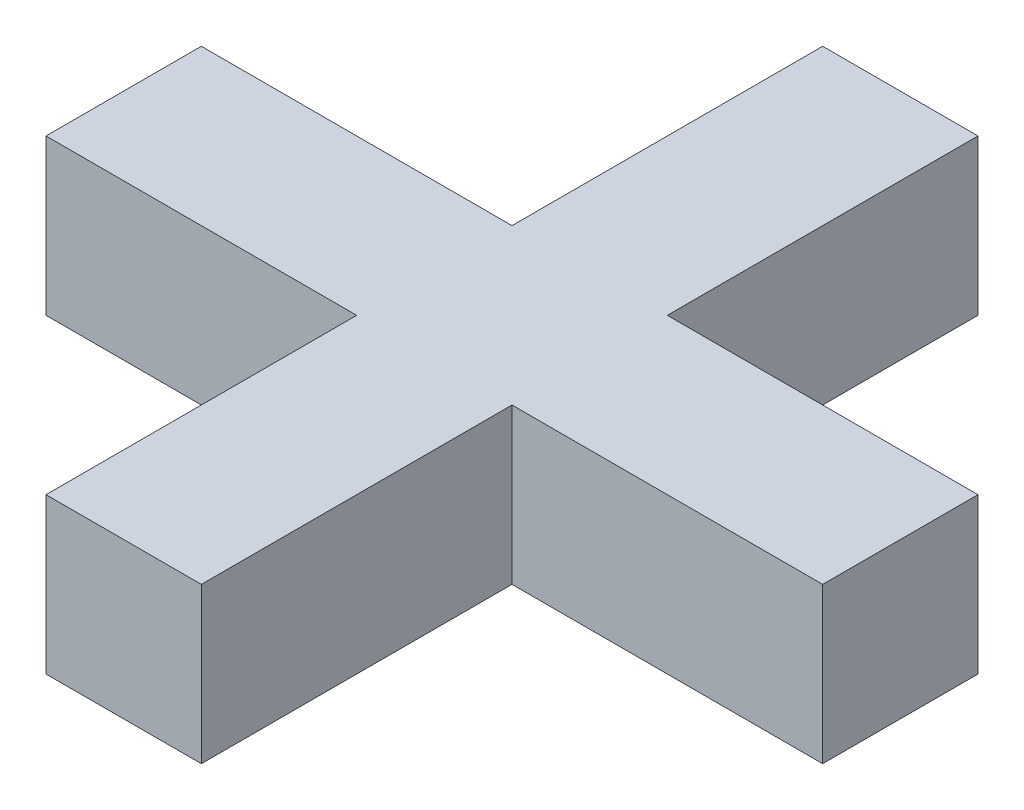
ISO-10303-21;
HEADER;
FILE_DESCRIPTION(('STEP AP214'),'2;1');
FILE_NAME('part.step','',(''),(''),'','','');
FILE_SCHEMA(('AUTOMOTIVE_DESIGN { 1 0 10303 214 1 1 1 1 }'));
ENDSEC;
DATA;
#1=APPLICATION_CONTEXT('core data for automotive mechanical design processes');
#2=APPLICATION_PROTOCOL_DEFINITION('international standard','automotive_design',2000,#1);
#3=PRODUCT_CONTEXT('',#1,'mechanical');
#4=PRODUCT('Part','Part','',(#3));
#5=PRODUCT_RELATED_PRODUCT_CATEGORY('part','',(#4));
#6=PRODUCT_DEFINITION_FORMATION('','',#4);
#7=PRODUCT_DEFINITION_CONTEXT('part definition',#1,'design');
#8=PRODUCT_DEFINITION('design','',#6,#7);
#9=PRODUCT_DEFINITION_SHAPE('','',#8);
#10=(LENGTH_UNIT() NAMED_UNIT(*) SI_UNIT(.MILLI.,.METRE.));
#11=(NAMED_UNIT(*) PLANE_ANGLE_UNIT() SI_UNIT($,.RADIAN.));
#12=(NAMED_UNIT(*) SI_UNIT($,.STERADIAN.) SOLID_ANGLE_UNIT());
#13=UNCERTAINTY_MEASURE_WITH_UNIT(LENGTH_MEASURE(1.E-05),#10,'distance_accuracy_value','');
#14=(GEOMETRIC_REPRESENTATION_CONTEXT(3) GLOBAL_UNCERTAINTY_ASSIGNED_CONTEXT((#13)) GLOBAL_UNIT_ASSIGNED_CONTEXT((#10,
#11,#12)) REPRESENTATION_CONTEXT('',''));
#15=CARTESIAN_POINT('',(0.,0.,0.));
#16=DIRECTION('',(0.,0.,1.));
#17=DIRECTION('',(1.,0.,0.));
#18=AXIS2_PLACEMENT_3D('',#15,#16,#17);
#19=CARTESIAN_POINT('',(-500.,200.,0.));
#20=DIRECTION('',(1.,0.,0.));
#21=DIRECTION('',(0.,0.,-1.));
#22=AXIS2_PLACEMENT_3D('',#19,#20,#21);
#23=PLANE('',#22);
#24=DIRECTION('',(0.,0.,1.));
#25=VECTOR('',#24,1.);
#26=CARTESIAN_POINT('',(-500.,0.,0.));
#27=LINE('',#26,#25);
#28=CARTESIAN_POINT('',(-500.,0.,-100.));
#29=VERTEX_POINT('',#28);
#30=CARTESIAN_POINT('',(-500.,0.,100.));
#31=VERTEX_POINT('',#30);
#32=EDGE_CURVE('E156',#29,#31,#27,.T.);
#33=ORIENTED_EDGE('',*,*,#32,.T.);
#34=DIRECTION('',(0.,-1.,0.));
#35=VECTOR('',#34,1.);
#36=CARTESIAN_POINT('',(-500.,200.,100.));
#37=LINE('',#36,#35);
#38=CARTESIAN_POINT('',(-500.,200.,100.));
#39=VERTEX_POINT('',#38);
#40=EDGE_CURVE('E11',#39,#31,#37,.T.);
#41=ORIENTED_EDGE('',*,*,#40,.F.);
#42=DIRECTION('',(0.,0.,1.));
#43=VECTOR('',#42,1.);
#44=CARTESIAN_POINT('',(-500.,200.,0.));
#45=LINE('',#44,#43);
#46=CARTESIAN_POINT('',(-500.,200.,-100.));
#47=VERTEX_POINT('',#46);
#48=EDGE_CURVE('E186',#47,#39,#45,.T.);
#49=ORIENTED_EDGE('',*,*,#48,.F.);
#50=DIRECTION('',(0.,-1.,0.));
#51=VECTOR('',#50,1.);
#52=CARTESIAN_POINT('',(-500.,200.,-100.));
#53=LINE('',#52,#51);
#54=EDGE_CURVE('E51',#47,#29,#53,.T.);
#55=ORIENTED_EDGE('',*,*,#54,.T.);
#56=EDGE_LOOP('',(#33,#41,#49,#55));
#57=FACE_BOUND('',#56,.T.);
#58=ADVANCED_FACE('F35',(#57),#23,.F.);
#59=CARTESIAN_POINT('',(0.,200.,100.));
#60=DIRECTION('',(0.,0.,-1.));
#61=DIRECTION('',(-1.,0.,0.));
#62=AXIS2_PLACEMENT_3D('',#59,#60,#61);
#63=PLANE('',#62);
#64=DIRECTION('',(1.,0.,0.));
#65=VECTOR('',#64,1.);
#66=CARTESIAN_POINT('',(0.,0.,100.));
#67=LINE('',#66,#65);
#68=CARTESIAN_POINT('',(-100.,0.,100.));
#69=VERTEX_POINT('',#68);
#70=EDGE_CURVE('E158',#31,#69,#67,.T.);
#71=ORIENTED_EDGE('',*,*,#70,.T.);
#72=DIRECTION('',(0.,-1.,0.));
#73=VECTOR('',#72,1.);
#74=CARTESIAN_POINT('',(-100.,200.,100.));
#75=LINE('',#74,#73);
#76=CARTESIAN_POINT('',(-100.,200.,100.));
#77=VERTEX_POINT('',#76);
#78=EDGE_CURVE('E43',#77,#69,#75,.T.);
#79=ORIENTED_EDGE('',*,*,#78,.F.);
#80=DIRECTION('',(1.,0.,0.));
#81=VECTOR('',#80,1.);
#82=CARTESIAN_POINT('',(0.,200.,100.));
#83=LINE('',#82,#81);
#84=EDGE_CURVE('E101',#39,#77,#83,.T.);
#85=ORIENTED_EDGE('',*,*,#84,.F.);
#86=ORIENTED_EDGE('',*,*,#40,.T.);
#87=EDGE_LOOP('',(#71,#79,#85,#86));
#88=FACE_BOUND('',#87,.T.);
#89=ADVANCED_FACE('F209',(#88),#63,.F.);
#90=CARTESIAN_POINT('',(-100.,200.,0.));
#91=DIRECTION('',(-1.,0.,0.));
#92=DIRECTION('',(0.,0.,1.));
#93=AXIS2_PLACEMENT_3D('',#90,#91,#92);
#94=PLANE('',#93);
#95=DIRECTION('',(0.,0.,-1.));
#96=VECTOR('',#95,1.);
#97=CARTESIAN_POINT('',(-100.,0.,0.));
#98=LINE('',#97,#96);
#99=CARTESIAN_POINT('',(-100.,0.,500.));
#100=VERTEX_POINT('',#99);
#101=EDGE_CURVE('E161',#100,#69,#98,.T.);
#102=ORIENTED_EDGE('',*,*,#101,.F.);
#103=DIRECTION('',(0.,-1.,0.));
#104=VECTOR('',#103,1.);
#105=CARTESIAN_POINT('',(-100.,200.,500.));
#106=LINE('',#105,#104);
#107=CARTESIAN_POINT('',(-100.,200.,500.));
#108=VERTEX_POINT('',#107);
#109=EDGE_CURVE('E202',#108,#100,#106,.T.);
#110=ORIENTED_EDGE('',*,*,#109,.F.);
#111=DIRECTION('',(0.,0.,-1.));
#112=VECTOR('',#111,1.);
#113=CARTESIAN_POINT('',(-100.,200.,0.));
#114=LINE('',#113,#112);
#115=EDGE_CURVE('E208',#108,#77,#114,.T.);
#116=ORIENTED_EDGE('',*,*,#115,.T.);
#117=ORIENTED_EDGE('',*,*,#78,.T.);
#118=EDGE_LOOP('',(#102,#110,#116,#117));
#119=FACE_BOUND('',#118,.T.);
#120=ADVANCED_FACE('F206',(#119),#94,.T.);
#121=CARTESIAN_POINT('',(0.,200.,500.));
#122=DIRECTION('',(0.,0.,-1.));
#123=DIRECTION('',(-1.,0.,0.));
#124=AXIS2_PLACEMENT_3D('',#121,#122,#123);
#125=PLANE('',#124);
#126=DIRECTION('',(1.,0.,0.));
#127=VECTOR('',#126,1.);
#128=CARTESIAN_POINT('',(0.,0.,500.));
#129=LINE('',#128,#127);
#130=CARTESIAN_POINT('',(100.,0.,500.));
#131=VERTEX_POINT('',#130);
#132=EDGE_CURVE('E164',#100,#131,#129,.T.);
#133=ORIENTED_EDGE('',*,*,#132,.T.);
#134=DIRECTION('',(0.,-1.,0.));
#135=VECTOR('',#134,1.);
#136=CARTESIAN_POINT('',(100.,200.,500.));
#137=LINE('',#136,#135);
#138=CARTESIAN_POINT('',(100.,200.,500.));
#139=VERTEX_POINT('',#138);
#140=EDGE_CURVE('E199',#139,#131,#137,.T.);
#141=ORIENTED_EDGE('',*,*,#140,.F.);
#142=DIRECTION('',(1.,0.,0.));
#143=VECTOR('',#142,1.);
#144=CARTESIAN_POINT('',(0.,200.,500.));
#145=LINE('',#144,#143);
#146=EDGE_CURVE('E227',#108,#139,#145,.T.);
#147=ORIENTED_EDGE('',*,*,#146,.F.);
#148=ORIENTED_EDGE('',*,*,#109,.T.);
#149=EDGE_LOOP('',(#133,#141,#147,#148));
#150=FACE_BOUND('',#149,.T.);
#151=ADVANCED_FACE('F218',(#150),#125,.F.);
#152=CARTESIAN_POINT('',(100.,200.,0.));
#153=DIRECTION('',(-1.,0.,0.));
#154=DIRECTION('',(0.,0.,1.));
#155=AXIS2_PLACEMENT_3D('',#152,#153,#154);
#156=PLANE('',#155);
#157=DIRECTION('',(0.,0.,-1.));
#158=VECTOR('',#157,1.);
#159=CARTESIAN_POINT('',(100.,0.,0.));
#160=LINE('',#159,#158);
#161=CARTESIAN_POINT('',(100.,0.,100.));
#162=VERTEX_POINT('',#161);
#163=EDGE_CURVE('E166',#131,#162,#160,.T.);
#164=ORIENTED_EDGE('',*,*,#163,.T.);
#165=DIRECTION('',(0.,-1.,0.));
#166=VECTOR('',#165,1.);
#167=CARTESIAN_POINT('',(100.,200.,100.));
#168=LINE('',#167,#166);
#169=CARTESIAN_POINT('',(100.,200.,100.));
#170=VERTEX_POINT('',#169);
#171=EDGE_CURVE('E196',#170,#162,#168,.T.);
#172=ORIENTED_EDGE('',*,*,#171,.F.);
#173=DIRECTION('',(0.,0.,-1.));
#174=VECTOR('',#173,1.);
#175=CARTESIAN_POINT('',(100.,200.,0.));
#176=LINE('',#175,#174);
#177=EDGE_CURVE('E224',#139,#170,#176,.T.);
#178=ORIENTED_EDGE('',*,*,#177,.F.);
#179=ORIENTED_EDGE('',*,*,#140,.T.);
#180=EDGE_LOOP('',(#164,#172,#178,#179));
#181=FACE_BOUND('',#180,.T.);
#182=ADVANCED_FACE('F222',(#181),#156,.F.);
#183=CARTESIAN_POINT('',(0.,200.,100.));
#184=DIRECTION('',(0.,0.,-1.));
#185=DIRECTION('',(-1.,0.,0.));
#186=AXIS2_PLACEMENT_3D('',#183,#184,#185);
#187=PLANE('',#186);
#188=DIRECTION('',(1.,0.,0.));
#189=VECTOR('',#188,1.);
#190=CARTESIAN_POINT('',(0.,0.,100.));
#191=LINE('',#190,#189);
#192=CARTESIAN_POINT('',(500.,0.,100.));
#193=VERTEX_POINT('',#192);
#194=EDGE_CURVE('E168',#162,#193,#191,.T.);
#195=ORIENTED_EDGE('',*,*,#194,.T.);
#196=DIRECTION('',(0.,-1.,0.));
#197=VECTOR('',#196,1.);
#198=CARTESIAN_POINT('',(500.,200.,100.));
#199=LINE('',#198,#197);
#200=CARTESIAN_POINT('',(500.,200.,100.));
#201=VERTEX_POINT('',#200);
#202=EDGE_CURVE('E194',#201,#193,#199,.T.);
#203=ORIENTED_EDGE('',*,*,#202,.F.);
#204=DIRECTION('',(1.,0.,0.));
#205=VECTOR('',#204,1.);
#206=CARTESIAN_POINT('',(0.,200.,100.));
#207=LINE('',#206,#205);
#208=EDGE_CURVE('E226',#170,#201,#207,.T.);
#209=ORIENTED_EDGE('',*,*,#208,.F.);
#210=ORIENTED_EDGE('',*,*,#171,.T.);
#211=EDGE_LOOP('',(#195,#203,#209,#210));
#212=FACE_BOUND('',#211,.T.);
#213=ADVANCED_FACE('F316',(#212),#187,.F.);
#214=CARTESIAN_POINT('',(500.,200.,0.));
#215=DIRECTION('',(1.,0.,0.));
#216=DIRECTION('',(0.,0.,-1.));
#217=AXIS2_PLACEMENT_3D('',#214,#215,#216);
#218=PLANE('',#217);
#219=DIRECTION('',(0.,0.,1.));
#220=VECTOR('',#219,1.);
#221=CARTESIAN_POINT('',(500.,0.,0.));
#222=LINE('',#221,#220);
#223=CARTESIAN_POINT('',(500.,0.,-100.));
#224=VERTEX_POINT('',#223);
#225=EDGE_CURVE('E171',#224,#193,#222,.T.);
#226=ORIENTED_EDGE('',*,*,#225,.F.);
#227=DIRECTION('',(0.,-1.,0.));
#228=VECTOR('',#227,1.);
#229=CARTESIAN_POINT('',(500.,200.,-100.));
#230=LINE('',#229,#228);
#231=CARTESIAN_POINT('',(500.,200.,-100.));
#232=VERTEX_POINT('',#231);
#233=EDGE_CURVE('E192',#232,#224,#230,.T.);
#234=ORIENTED_EDGE('',*,*,#233,.F.);
#235=DIRECTION('',(0.,0.,1.));
#236=VECTOR('',#235,1.);
#237=CARTESIAN_POINT('',(500.,200.,0.));
#238=LINE('',#237,#236);
#239=EDGE_CURVE('E229',#232,#201,#238,.T.);
#240=ORIENTED_EDGE('',*,*,#239,.T.);
#241=ORIENTED_EDGE('',*,*,#202,.T.);
#242=EDGE_LOOP('',(#226,#234,#240,#241));
#243=FACE_BOUND('',#242,.T.);
#244=ADVANCED_FACE('F245',(#243),#218,.T.);
#245=CARTESIAN_POINT('',(0.,200.,-100.));
#246=DIRECTION('',(0.,0.,-1.));
#247=DIRECTION('',(-1.,0.,0.));
#248=AXIS2_PLACEMENT_3D('',#245,#246,#247);
#249=PLANE('',#248);
#250=DIRECTION('',(1.,0.,0.));
#251=VECTOR('',#250,1.);
#252=CARTESIAN_POINT('',(0.,0.,-100.));
#253=LINE('',#252,#251);
#254=CARTESIAN_POINT('',(100.,0.,-100.));
#255=VERTEX_POINT('',#254);
#256=EDGE_CURVE('E174',#255,#224,#253,.T.);
#257=ORIENTED_EDGE('',*,*,#256,.F.);
#258=DIRECTION('',(0.,-1.,0.));
#259=VECTOR('',#258,1.);
#260=CARTESIAN_POINT('',(100.,200.,-100.));
#261=LINE('',#260,#259);
#262=CARTESIAN_POINT('',(100.,200.,-100.));
#263=VERTEX_POINT('',#262);
#264=EDGE_CURVE('E190',#263,#255,#261,.T.);
#265=ORIENTED_EDGE('',*,*,#264,.F.);
#266=DIRECTION('',(1.,0.,0.));
#267=VECTOR('',#266,1.);
#268=CARTESIAN_POINT('',(0.,200.,-100.));
#269=LINE('',#268,#267);
#270=EDGE_CURVE('E236',#263,#232,#269,.T.);
#271=ORIENTED_EDGE('',*,*,#270,.T.);
#272=ORIENTED_EDGE('',*,*,#233,.T.);
#273=EDGE_LOOP('',(#257,#265,#271,#272));
#274=FACE_BOUND('',#273,.T.);
#275=ADVANCED_FACE('F240',(#274),#249,.T.);
#276=CARTESIAN_POINT('',(100.,200.,0.));
#277=DIRECTION('',(-1.,0.,0.));
#278=DIRECTION('',(0.,0.,1.));
#279=AXIS2_PLACEMENT_3D('',#276,#277,#278);
#280=PLANE('',#279);
#281=DIRECTION('',(0.,0.,-1.));
#282=VECTOR('',#281,1.);
#283=CARTESIAN_POINT('',(100.,0.,0.));
#284=LINE('',#283,#282);
#285=CARTESIAN_POINT('',(100.,0.,-500.));
#286=VERTEX_POINT('',#285);
#287=EDGE_CURVE('E177',#255,#286,#284,.T.);
#288=ORIENTED_EDGE('',*,*,#287,.T.);
#289=DIRECTION('',(0.,-1.,0.));
#290=VECTOR('',#289,1.);
#291=CARTESIAN_POINT('',(100.,200.,-500.));
#292=LINE('',#291,#290);
#293=CARTESIAN_POINT('',(100.,200.,-500.));
#294=VERTEX_POINT('',#293);
#295=EDGE_CURVE('E138',#294,#286,#292,.T.);
#296=ORIENTED_EDGE('',*,*,#295,.F.);
#297=DIRECTION('',(0.,0.,-1.));
#298=VECTOR('',#297,1.);
#299=CARTESIAN_POINT('',(100.,200.,0.));
#300=LINE('',#299,#298);
#301=EDGE_CURVE('E147',#263,#294,#300,.T.);
#302=ORIENTED_EDGE('',*,*,#301,.F.);
#303=ORIENTED_EDGE('',*,*,#264,.T.);
#304=EDGE_LOOP('',(#288,#296,#302,#303));
#305=FACE_BOUND('',#304,.T.);
#306=ADVANCED_FACE('F248',(#305),#280,.F.);
#307=CARTESIAN_POINT('',(0.,200.,-500.));
#308=DIRECTION('',(0.,0.,-1.));
#309=DIRECTION('',(-1.,0.,0.));
#310=AXIS2_PLACEMENT_3D('',#307,#308,#309);
#311=PLANE('',#310);
#312=DIRECTION('',(1.,0.,0.));
#313=VECTOR('',#312,1.);
#314=CARTESIAN_POINT('',(0.,0.,-500.));
#315=LINE('',#314,#313);
#316=CARTESIAN_POINT('',(-100.,0.,-500.));
#317=VERTEX_POINT('',#316);
#318=EDGE_CURVE('E134',#317,#286,#315,.T.);
#319=ORIENTED_EDGE('',*,*,#318,.F.);
#320=DIRECTION('',(0.,-1.,0.));
#321=VECTOR('',#320,1.);
#322=CARTESIAN_POINT('',(-100.,200.,-500.));
#323=LINE('',#322,#321);
#324=CARTESIAN_POINT('',(-100.,200.,-500.));
#325=VERTEX_POINT('',#324);
#326=EDGE_CURVE('E129',#325,#317,#323,.T.);
#327=ORIENTED_EDGE('',*,*,#326,.F.);
#328=DIRECTION('',(1.,0.,0.));
#329=VECTOR('',#328,1.);
#330=CARTESIAN_POINT('',(0.,200.,-500.));
#331=LINE('',#330,#329);
#332=EDGE_CURVE('E132',#325,#294,#331,.T.);
#333=ORIENTED_EDGE('',*,*,#332,.T.);
#334=ORIENTED_EDGE('',*,*,#295,.T.);
#335=EDGE_LOOP('',(#319,#327,#333,#334));
#336=FACE_BOUND('',#335,.T.);
#337=ADVANCED_FACE('F131',(#336),#311,.T.);
#338=CARTESIAN_POINT('',(-100.,200.,0.));
#339=DIRECTION('',(-1.,0.,0.));
#340=DIRECTION('',(0.,0.,1.));
#341=AXIS2_PLACEMENT_3D('',#338,#339,#340);
#342=PLANE('',#341);
#343=DIRECTION('',(0.,0.,-1.));
#344=VECTOR('',#343,1.);
#345=CARTESIAN_POINT('',(-100.,0.,0.));
#346=LINE('',#345,#344);
#347=CARTESIAN_POINT('',(-100.,0.,-100.));
#348=VERTEX_POINT('',#347);
#349=EDGE_CURVE('E181',#348,#317,#346,.T.);
#350=ORIENTED_EDGE('',*,*,#349,.F.);
#351=DIRECTION('',(0.,-1.,0.));
#352=VECTOR('',#351,1.);
#353=CARTESIAN_POINT('',(-100.,200.,-100.));
#354=LINE('',#353,#352);
#355=CARTESIAN_POINT('',(-100.,200.,-100.));
#356=VERTEX_POINT('',#355);
#357=EDGE_CURVE('E89',#356,#348,#354,.T.);
#358=ORIENTED_EDGE('',*,*,#357,.F.);
#359=DIRECTION('',(0.,0.,-1.));
#360=VECTOR('',#359,1.);
#361=CARTESIAN_POINT('',(-100.,200.,0.));
#362=LINE('',#361,#360);
#363=EDGE_CURVE('E144',#356,#325,#362,.T.);
#364=ORIENTED_EDGE('',*,*,#363,.T.);
#365=ORIENTED_EDGE('',*,*,#326,.T.);
#366=EDGE_LOOP('',(#350,#358,#364,#365));
#367=FACE_BOUND('',#366,.T.);
#368=ADVANCED_FACE('F150',(#367),#342,.T.);
#369=CARTESIAN_POINT('',(0.,200.,-100.));
#370=DIRECTION('',(0.,0.,-1.));
#371=DIRECTION('',(-1.,0.,0.));
#372=AXIS2_PLACEMENT_3D('',#369,#370,#371);
#373=PLANE('',#372);
#374=DIRECTION('',(1.,0.,0.));
#375=VECTOR('',#374,1.);
#376=CARTESIAN_POINT('',(0.,0.,-100.));
#377=LINE('',#376,#375);
#378=EDGE_CURVE('E183',#29,#348,#377,.T.);
#379=ORIENTED_EDGE('',*,*,#378,.F.);
#380=ORIENTED_EDGE('',*,*,#54,.F.);
#381=DIRECTION('',(1.,0.,0.));
#382=VECTOR('',#381,1.);
#383=CARTESIAN_POINT('',(0.,200.,-100.));
#384=LINE('',#383,#382);
#385=EDGE_CURVE('E151',#47,#356,#384,.T.);
#386=ORIENTED_EDGE('',*,*,#385,.T.);
#387=ORIENTED_EDGE('',*,*,#357,.T.);
#388=EDGE_LOOP('',(#379,#380,#386,#387));
#389=FACE_BOUND('',#388,.T.);
#390=ADVANCED_FACE('F261',(#389),#373,.T.);
#391=CARTESIAN_POINT('',(0.,200.,0.));
#392=DIRECTION('',(0.,1.,0.));
#393=DIRECTION('',(0.,0.,1.));
#394=AXIS2_PLACEMENT_3D('',#391,#392,#393);
#395=PLANE('',#394);
#396=ORIENTED_EDGE('',*,*,#48,.T.);
#397=ORIENTED_EDGE('',*,*,#84,.T.);
#398=ORIENTED_EDGE('',*,*,#115,.F.);
#399=ORIENTED_EDGE('',*,*,#146,.T.);
#400=ORIENTED_EDGE('',*,*,#177,.T.);
#401=ORIENTED_EDGE('',*,*,#208,.T.);
#402=ORIENTED_EDGE('',*,*,#239,.F.);
#403=ORIENTED_EDGE('',*,*,#270,.F.);
#404=ORIENTED_EDGE('',*,*,#301,.T.);
#405=ORIENTED_EDGE('',*,*,#332,.F.);
#406=ORIENTED_EDGE('',*,*,#363,.F.);
#407=ORIENTED_EDGE('',*,*,#385,.F.);
#408=EDGE_LOOP('',(#396,#397,#398,#399,#400,#401,#402,#403,#404,#405,#406,#407));
#409=FACE_BOUND('',#408,.T.);
#410=ADVANCED_FACE('F142',(#409),#395,.T.);
#411=CARTESIAN_POINT('',(0.,0.,0.));
#412=DIRECTION('',(0.,1.,0.));
#413=DIRECTION('',(0.,0.,1.));
#414=AXIS2_PLACEMENT_3D('',#411,#412,#413);
#415=PLANE('',#414);
#416=ORIENTED_EDGE('',*,*,#32,.F.);
#417=ORIENTED_EDGE('',*,*,#378,.T.);
#418=ORIENTED_EDGE('',*,*,#349,.T.);
#419=ORIENTED_EDGE('',*,*,#318,.T.);
#420=ORIENTED_EDGE('',*,*,#287,.F.);
#421=ORIENTED_EDGE('',*,*,#256,.T.);
#422=ORIENTED_EDGE('',*,*,#225,.T.);
#423=ORIENTED_EDGE('',*,*,#194,.F.);
#424=ORIENTED_EDGE('',*,*,#163,.F.);
#425=ORIENTED_EDGE('',*,*,#132,.F.);
#426=ORIENTED_EDGE('',*,*,#101,.T.);
#427=ORIENTED_EDGE('',*,*,#70,.F.);
#428=EDGE_LOOP('',(#416,#417,#418,#419,#420,#421,#422,#423,#424,#425,#426,#427));
#429=FACE_BOUND('',#428,.T.);
#430=ADVANCED_FACE('F213',(#429),#415,.F.);
#431=CLOSED_SHELL('',(#58,#89,#120,#151,#182,#213,#244,#275,#306,#337,#368,#390,#410,#430));
#432=MANIFOLD_SOLID_BREP('B2',#431);
#433=ADVANCED_BREP_SHAPE_REPRESENTATION('',(#18,#432),#14);
#434=SHAPE_DEFINITION_REPRESENTATION(#9,#433);
ENDSEC;
END-ISO-10303-21;
